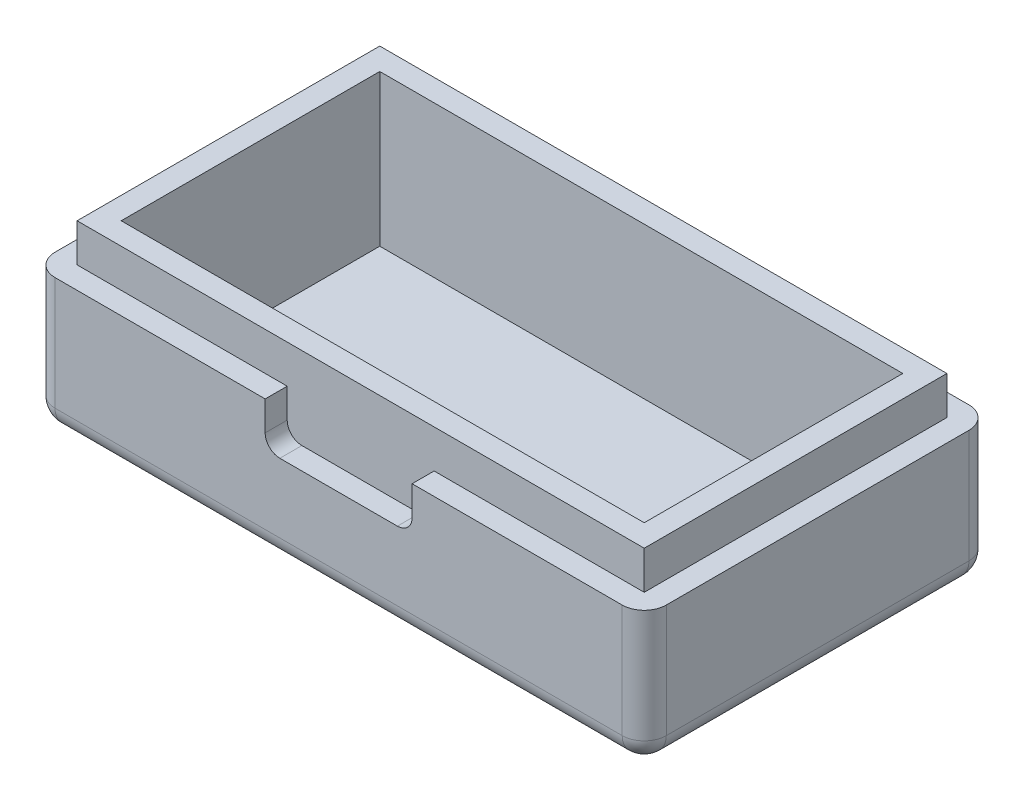
ISO-10303-21;
HEADER;
FILE_DESCRIPTION(('STEP AP214'),'2;1');
FILE_NAME('part.step','',(''),(''),'','','');
FILE_SCHEMA(('AUTOMOTIVE_DESIGN { 1 0 10303 214 1 1 1 1 }'));
ENDSEC;
DATA;
#1=APPLICATION_CONTEXT('core data for automotive mechanical design processes');
#2=APPLICATION_PROTOCOL_DEFINITION('international standard','automotive_design',2000,#1);
#3=PRODUCT_CONTEXT('',#1,'mechanical');
#4=PRODUCT('Part','Part','',(#3));
#5=PRODUCT_RELATED_PRODUCT_CATEGORY('part','',(#4));
#6=PRODUCT_DEFINITION_FORMATION('','',#4);
#7=PRODUCT_DEFINITION_CONTEXT('part definition',#1,'design');
#8=PRODUCT_DEFINITION('design','',#6,#7);
#9=PRODUCT_DEFINITION_SHAPE('','',#8);
#10=(LENGTH_UNIT() NAMED_UNIT(*) SI_UNIT(.MILLI.,.METRE.));
#11=(NAMED_UNIT(*) PLANE_ANGLE_UNIT() SI_UNIT($,.RADIAN.));
#12=(NAMED_UNIT(*) SI_UNIT($,.STERADIAN.) SOLID_ANGLE_UNIT());
#13=UNCERTAINTY_MEASURE_WITH_UNIT(LENGTH_MEASURE(1.E-05),#10,'distance_accuracy_value','');
#14=(GEOMETRIC_REPRESENTATION_CONTEXT(3) GLOBAL_UNCERTAINTY_ASSIGNED_CONTEXT((#13)) GLOBAL_UNIT_ASSIGNED_CONTEXT((#10,
#11,#12)) REPRESENTATION_CONTEXT('',''));
#15=CARTESIAN_POINT('',(0.,0.,0.));
#16=DIRECTION('',(0.,0.,1.));
#17=DIRECTION('',(1.,0.,0.));
#18=AXIS2_PLACEMENT_3D('',#15,#16,#17);
#19=CARTESIAN_POINT('',(0.,9.2,0.));
#20=DIRECTION('',(0.,1.,0.));
#21=DIRECTION('',(0.,0.,1.));
#22=AXIS2_PLACEMENT_3D('',#19,#20,#21);
#23=PLANE('',#22);
#24=DIRECTION('',(0.,0.,1.));
#25=VECTOR('',#24,1.);
#26=CARTESIAN_POINT('',(15.8,9.2,-11.9403065089106));
#27=LINE('',#26,#25);
#28=CARTESIAN_POINT('',(15.8,9.2,-1.5));
#29=VERTEX_POINT('',#28);
#30=CARTESIAN_POINT('',(15.8,9.2,0.));
#31=VERTEX_POINT('',#30);
#32=EDGE_CURVE('E263',#29,#31,#27,.T.);
#33=ORIENTED_EDGE('',*,*,#32,.F.);
#34=DIRECTION('',(1.,0.,0.));
#35=VECTOR('',#34,1.);
#36=CARTESIAN_POINT('',(1.5,9.2,-1.5));
#37=LINE('',#36,#35);
#38=CARTESIAN_POINT('',(1.5,9.2,-1.5));
#39=VERTEX_POINT('',#38);
#40=EDGE_CURVE('E316',#39,#29,#37,.T.);
#41=ORIENTED_EDGE('',*,*,#40,.F.);
#42=DIRECTION('',(0.,0.,1.));
#43=VECTOR('',#42,1.);
#44=CARTESIAN_POINT('',(1.5,9.2,-22.1));
#45=LINE('',#44,#43);
#46=CARTESIAN_POINT('',(1.5,9.2,-22.1));
#47=VERTEX_POINT('',#46);
#48=EDGE_CURVE('E311',#47,#39,#45,.T.);
#49=ORIENTED_EDGE('',*,*,#48,.F.);
#50=DIRECTION('',(-1.,0.,0.));
#51=VECTOR('',#50,1.);
#52=CARTESIAN_POINT('',(1.5,9.2,-22.1));
#53=LINE('',#52,#51);
#54=CARTESIAN_POINT('',(15.8,9.2,-22.1));
#55=VERTEX_POINT('',#54);
#56=EDGE_CURVE('E322',#55,#47,#53,.T.);
#57=ORIENTED_EDGE('',*,*,#56,.F.);
#58=DIRECTION('',(0.,0.,-1.));
#59=VECTOR('',#58,1.);
#60=CARTESIAN_POINT('',(15.8,9.2,-11.6596934910894));
#61=LINE('',#60,#59);
#62=CARTESIAN_POINT('',(15.8,9.2,-23.6));
#63=VERTEX_POINT('',#62);
#64=EDGE_CURVE('E299',#55,#63,#61,.T.);
#65=ORIENTED_EDGE('',*,*,#64,.T.);
#66=DIRECTION('',(-1.,0.,0.));
#67=VECTOR('',#66,1.);
#68=CARTESIAN_POINT('',(0.,9.2,-23.6));
#69=LINE('',#68,#67);
#70=CARTESIAN_POINT('',(1.49999999999999,9.2,-23.6));
#71=VERTEX_POINT('',#70);
#72=EDGE_CURVE('E356',#63,#71,#69,.T.);
#73=ORIENTED_EDGE('',*,*,#72,.T.);
#74=CARTESIAN_POINT('',(1.49999999999999,9.2,-22.1));
#75=DIRECTION('',(0.,1.,0.));
#76=DIRECTION('',(0.,0.,1.));
#77=AXIS2_PLACEMENT_3D('',#74,#75,#76);
#78=CIRCLE('',#77,1.5);
#79=CARTESIAN_POINT('',(0.,9.2,-22.1));
#80=VERTEX_POINT('',#79);
#81=EDGE_CURVE('E430',#71,#80,#78,.T.);
#82=ORIENTED_EDGE('',*,*,#81,.T.);
#83=DIRECTION('',(0.,0.,1.));
#84=VECTOR('',#83,1.);
#85=CARTESIAN_POINT('',(0.,9.2,-23.6));
#86=LINE('',#85,#84);
#87=CARTESIAN_POINT('',(0.,9.2,-1.5));
#88=VERTEX_POINT('',#87);
#89=EDGE_CURVE('E340',#80,#88,#86,.T.);
#90=ORIENTED_EDGE('',*,*,#89,.T.);
#91=CARTESIAN_POINT('',(1.5,9.2,-1.5));
#92=DIRECTION('',(0.,1.,0.));
#93=DIRECTION('',(0.,0.,1.));
#94=AXIS2_PLACEMENT_3D('',#91,#92,#93);
#95=CIRCLE('',#94,1.5);
#96=CARTESIAN_POINT('',(1.5,9.2,0.));
#97=VERTEX_POINT('',#96);
#98=EDGE_CURVE('E43',#88,#97,#95,.T.);
#99=ORIENTED_EDGE('',*,*,#98,.T.);
#100=DIRECTION('',(1.,0.,0.));
#101=VECTOR('',#100,1.);
#102=CARTESIAN_POINT('',(0.,9.2,0.));
#103=LINE('',#102,#101);
#104=EDGE_CURVE('E350',#97,#31,#103,.T.);
#105=ORIENTED_EDGE('',*,*,#104,.T.);
#106=EDGE_LOOP('',(#33,#41,#49,#57,#65,#73,#82,#90,#99,#105));
#107=FACE_BOUND('',#106,.T.);
#108=ADVANCED_FACE('F34',(#107),#23,.T.);
#109=CARTESIAN_POINT('',(0.,11.8,0.));
#110=DIRECTION('',(0.,-1.,0.));
#111=DIRECTION('',(0.,0.,-1.));
#112=AXIS2_PLACEMENT_3D('',#109,#110,#111);
#113=PLANE('',#112);
#114=DIRECTION('',(-1.,0.,0.));
#115=VECTOR('',#114,1.);
#116=CARTESIAN_POINT('',(2.99999999999999,11.8,-20.6));
#117=LINE('',#116,#115);
#118=CARTESIAN_POINT('',(38.6,11.8,-20.6));
#119=VERTEX_POINT('',#118);
#120=CARTESIAN_POINT('',(2.99999999999999,11.8,-20.6));
#121=VERTEX_POINT('',#120);
#122=EDGE_CURVE('E376',#119,#121,#117,.T.);
#123=ORIENTED_EDGE('',*,*,#122,.F.);
#124=DIRECTION('',(0.,0.,-1.));
#125=VECTOR('',#124,1.);
#126=CARTESIAN_POINT('',(38.6,11.8,-3.00000000000001));
#127=LINE('',#126,#125);
#128=CARTESIAN_POINT('',(38.6,11.8,-3.00000000000001));
#129=VERTEX_POINT('',#128);
#130=EDGE_CURVE('E360',#129,#119,#127,.T.);
#131=ORIENTED_EDGE('',*,*,#130,.F.);
#132=DIRECTION('',(1.,0.,0.));
#133=VECTOR('',#132,1.);
#134=CARTESIAN_POINT('',(2.99999999999999,11.8,-3.00000000000001));
#135=LINE('',#134,#133);
#136=CARTESIAN_POINT('',(2.99999999999999,11.8,-3.00000000000001));
#137=VERTEX_POINT('',#136);
#138=EDGE_CURVE('E365',#137,#129,#135,.T.);
#139=ORIENTED_EDGE('',*,*,#138,.F.);
#140=DIRECTION('',(0.,0.,1.));
#141=VECTOR('',#140,1.);
#142=CARTESIAN_POINT('',(2.99999999999999,11.8,-3.00000000000001));
#143=LINE('',#142,#141);
#144=EDGE_CURVE('E379',#121,#137,#143,.T.);
#145=ORIENTED_EDGE('',*,*,#144,.F.);
#146=EDGE_LOOP('',(#123,#131,#139,#145));
#147=FACE_BOUND('',#146,.T.);
#148=DIRECTION('',(0.,0.,1.));
#149=VECTOR('',#148,1.);
#150=CARTESIAN_POINT('',(1.5,11.8,-22.1));
#151=LINE('',#150,#149);
#152=CARTESIAN_POINT('',(1.5,11.8,-22.1));
#153=VERTEX_POINT('',#152);
#154=CARTESIAN_POINT('',(1.5,11.8,-1.5));
#155=VERTEX_POINT('',#154);
#156=EDGE_CURVE('E327',#153,#155,#151,.T.);
#157=ORIENTED_EDGE('',*,*,#156,.T.);
#158=DIRECTION('',(1.,0.,0.));
#159=VECTOR('',#158,1.);
#160=CARTESIAN_POINT('',(1.5,11.8,-1.5));
#161=LINE('',#160,#159);
#162=CARTESIAN_POINT('',(40.1,11.8,-1.5));
#163=VERTEX_POINT('',#162);
#164=EDGE_CURVE('E330',#155,#163,#161,.T.);
#165=ORIENTED_EDGE('',*,*,#164,.T.);
#166=DIRECTION('',(0.,0.,-1.));
#167=VECTOR('',#166,1.);
#168=CARTESIAN_POINT('',(40.1,11.8,-22.1));
#169=LINE('',#168,#167);
#170=CARTESIAN_POINT('',(40.1,11.8,-22.1));
#171=VERTEX_POINT('',#170);
#172=EDGE_CURVE('E333',#163,#171,#169,.T.);
#173=ORIENTED_EDGE('',*,*,#172,.T.);
#174=DIRECTION('',(-1.,0.,0.));
#175=VECTOR('',#174,1.);
#176=CARTESIAN_POINT('',(1.5,11.8,-22.1));
#177=LINE('',#176,#175);
#178=EDGE_CURVE('E315',#171,#153,#177,.T.);
#179=ORIENTED_EDGE('',*,*,#178,.T.);
#180=EDGE_LOOP('',(#157,#165,#173,#179));
#181=FACE_BOUND('',#180,.T.);
#182=ADVANCED_FACE('F521',(#147,#181),#113,.F.);
#183=CARTESIAN_POINT('',(38.6,1.5,-3.00000000000001));
#184=DIRECTION('',(1.,0.,0.));
#185=DIRECTION('',(0.,0.,-1.));
#186=AXIS2_PLACEMENT_3D('',#183,#184,#185);
#187=PLANE('',#186);
#188=ORIENTED_EDGE('',*,*,#130,.T.);
#189=DIRECTION('',(0.,1.,0.));
#190=VECTOR('',#189,1.);
#191=CARTESIAN_POINT('',(38.6,1.5,-20.6));
#192=LINE('',#191,#190);
#193=CARTESIAN_POINT('',(38.6,1.5,-20.6));
#194=VERTEX_POINT('',#193);
#195=EDGE_CURVE('E374',#194,#119,#192,.T.);
#196=ORIENTED_EDGE('',*,*,#195,.F.);
#197=DIRECTION('',(0.,0.,-1.));
#198=VECTOR('',#197,1.);
#199=CARTESIAN_POINT('',(38.6,1.5,-3.00000000000001));
#200=LINE('',#199,#198);
#201=CARTESIAN_POINT('',(38.6,1.5,-3.00000000000001));
#202=VERTEX_POINT('',#201);
#203=EDGE_CURVE('E361',#202,#194,#200,.T.);
#204=ORIENTED_EDGE('',*,*,#203,.F.);
#205=DIRECTION('',(0.,1.,0.));
#206=VECTOR('',#205,1.);
#207=CARTESIAN_POINT('',(38.6,1.5,-3.00000000000001));
#208=LINE('',#207,#206);
#209=EDGE_CURVE('E384',#202,#129,#208,.T.);
#210=ORIENTED_EDGE('',*,*,#209,.T.);
#211=EDGE_LOOP('',(#188,#196,#204,#210));
#212=FACE_BOUND('',#211,.T.);
#213=ADVANCED_FACE('F529',(#212),#187,.F.);
#214=CARTESIAN_POINT('',(2.99999999999999,1.5,-3.00000000000001));
#215=DIRECTION('',(0.,0.,1.));
#216=DIRECTION('',(1.,0.,0.));
#217=AXIS2_PLACEMENT_3D('',#214,#215,#216);
#218=PLANE('',#217);
#219=ORIENTED_EDGE('',*,*,#138,.T.);
#220=ORIENTED_EDGE('',*,*,#209,.F.);
#221=DIRECTION('',(1.,0.,0.));
#222=VECTOR('',#221,1.);
#223=CARTESIAN_POINT('',(2.99999999999999,1.5,-3.00000000000001));
#224=LINE('',#223,#222);
#225=CARTESIAN_POINT('',(2.99999999999999,1.5,-3.00000000000001));
#226=VERTEX_POINT('',#225);
#227=EDGE_CURVE('E371',#226,#202,#224,.T.);
#228=ORIENTED_EDGE('',*,*,#227,.F.);
#229=DIRECTION('',(0.,1.,0.));
#230=VECTOR('',#229,1.);
#231=CARTESIAN_POINT('',(2.99999999999999,1.5,-3.00000000000001));
#232=LINE('',#231,#230);
#233=EDGE_CURVE('E387',#226,#137,#232,.T.);
#234=ORIENTED_EDGE('',*,*,#233,.T.);
#235=EDGE_LOOP('',(#219,#220,#228,#234));
#236=FACE_BOUND('',#235,.T.);
#237=ADVANCED_FACE('F873',(#236),#218,.F.);
#238=CARTESIAN_POINT('',(2.99999999999999,1.5,-3.00000000000001));
#239=DIRECTION('',(-1.,0.,0.));
#240=DIRECTION('',(0.,0.,1.));
#241=AXIS2_PLACEMENT_3D('',#238,#239,#240);
#242=PLANE('',#241);
#243=ORIENTED_EDGE('',*,*,#144,.T.);
#244=ORIENTED_EDGE('',*,*,#233,.F.);
#245=DIRECTION('',(0.,0.,1.));
#246=VECTOR('',#245,1.);
#247=CARTESIAN_POINT('',(2.99999999999999,1.5,-3.00000000000001));
#248=LINE('',#247,#246);
#249=CARTESIAN_POINT('',(2.99999999999999,1.5,-20.6));
#250=VERTEX_POINT('',#249);
#251=EDGE_CURVE('E368',#250,#226,#248,.T.);
#252=ORIENTED_EDGE('',*,*,#251,.F.);
#253=DIRECTION('',(0.,1.,0.));
#254=VECTOR('',#253,1.);
#255=CARTESIAN_POINT('',(2.99999999999999,1.5,-20.6));
#256=LINE('',#255,#254);
#257=EDGE_CURVE('E389',#250,#121,#256,.T.);
#258=ORIENTED_EDGE('',*,*,#257,.T.);
#259=EDGE_LOOP('',(#243,#244,#252,#258));
#260=FACE_BOUND('',#259,.T.);
#261=ADVANCED_FACE('F864',(#260),#242,.F.);
#262=CARTESIAN_POINT('',(2.99999999999999,1.5,-20.6));
#263=DIRECTION('',(0.,0.,-1.));
#264=DIRECTION('',(-1.,0.,0.));
#265=AXIS2_PLACEMENT_3D('',#262,#263,#264);
#266=PLANE('',#265);
#267=ORIENTED_EDGE('',*,*,#122,.T.);
#268=ORIENTED_EDGE('',*,*,#257,.F.);
#269=DIRECTION('',(-1.,0.,0.));
#270=VECTOR('',#269,1.);
#271=CARTESIAN_POINT('',(2.99999999999999,1.5,-20.6));
#272=LINE('',#271,#270);
#273=EDGE_CURVE('E364',#194,#250,#272,.T.);
#274=ORIENTED_EDGE('',*,*,#273,.F.);
#275=ORIENTED_EDGE('',*,*,#195,.T.);
#276=EDGE_LOOP('',(#267,#268,#274,#275));
#277=FACE_BOUND('',#276,.T.);
#278=ADVANCED_FACE('F543',(#277),#266,.F.);
#279=CARTESIAN_POINT('',(0.,1.5,0.));
#280=DIRECTION('',(0.,-1.,0.));
#281=DIRECTION('',(0.,0.,-1.));
#282=AXIS2_PLACEMENT_3D('',#279,#280,#281);
#283=PLANE('',#282);
#284=ORIENTED_EDGE('',*,*,#203,.T.);
#285=ORIENTED_EDGE('',*,*,#273,.T.);
#286=ORIENTED_EDGE('',*,*,#251,.T.);
#287=ORIENTED_EDGE('',*,*,#227,.T.);
#288=EDGE_LOOP('',(#284,#285,#286,#287));
#289=FACE_BOUND('',#288,.T.);
#290=ADVANCED_FACE('F535',(#289),#283,.F.);
#291=DIRECTION('',(0.,0.,1.));
#292=VECTOR('',#291,1.);
#293=CARTESIAN_POINT('',(25.8,9.2,-11.9403065089106));
#294=LINE('',#293,#292);
#295=CARTESIAN_POINT('',(25.8,9.2,-1.5));
#296=VERTEX_POINT('',#295);
#297=CARTESIAN_POINT('',(25.8,9.2,0.));
#298=VERTEX_POINT('',#297);
#299=EDGE_CURVE('E265',#296,#298,#294,.T.);
#300=ORIENTED_EDGE('',*,*,#299,.T.);
#301=CARTESIAN_POINT('',(40.1,9.2,0.));
#302=VERTEX_POINT('',#301);
#303=EDGE_CURVE('E349',#298,#302,#103,.T.);
#304=ORIENTED_EDGE('',*,*,#303,.T.);
#305=CARTESIAN_POINT('',(40.1,9.2,-1.5));
#306=DIRECTION('',(0.,1.,0.));
#307=DIRECTION('',(0.,0.,1.));
#308=AXIS2_PLACEMENT_3D('',#305,#306,#307);
#309=CIRCLE('',#308,1.5);
#310=CARTESIAN_POINT('',(41.6,9.2,-1.5));
#311=VERTEX_POINT('',#310);
#312=EDGE_CURVE('E11',#302,#311,#309,.T.);
#313=ORIENTED_EDGE('',*,*,#312,.T.);
#314=DIRECTION('',(0.,0.,-1.));
#315=VECTOR('',#314,1.);
#316=CARTESIAN_POINT('',(41.6,9.2,-23.6));
#317=LINE('',#316,#315);
#318=CARTESIAN_POINT('',(41.6,9.2,-22.1));
#319=VERTEX_POINT('',#318);
#320=EDGE_CURVE('E353',#311,#319,#317,.T.);
#321=ORIENTED_EDGE('',*,*,#320,.T.);
#322=CARTESIAN_POINT('',(40.1,9.2,-22.1));
#323=DIRECTION('',(0.,1.,0.));
#324=DIRECTION('',(0.,0.,1.));
#325=AXIS2_PLACEMENT_3D('',#322,#323,#324);
#326=CIRCLE('',#325,1.5);
#327=CARTESIAN_POINT('',(40.1,9.2,-23.6));
#328=VERTEX_POINT('',#327);
#329=EDGE_CURVE('E428',#319,#328,#326,.T.);
#330=ORIENTED_EDGE('',*,*,#329,.T.);
#331=CARTESIAN_POINT('',(25.8,9.2,-23.6));
#332=VERTEX_POINT('',#331);
#333=EDGE_CURVE('E357',#328,#332,#69,.T.);
#334=ORIENTED_EDGE('',*,*,#333,.T.);
#335=DIRECTION('',(0.,0.,-1.));
#336=VECTOR('',#335,1.);
#337=CARTESIAN_POINT('',(25.8,9.2,-11.6596934910894));
#338=LINE('',#337,#336);
#339=CARTESIAN_POINT('',(25.8,9.2,-22.1));
#340=VERTEX_POINT('',#339);
#341=EDGE_CURVE('E278',#340,#332,#338,.T.);
#342=ORIENTED_EDGE('',*,*,#341,.F.);
#343=CARTESIAN_POINT('',(40.1,9.2,-22.1));
#344=VERTEX_POINT('',#343);
#345=EDGE_CURVE('E323',#344,#340,#53,.T.);
#346=ORIENTED_EDGE('',*,*,#345,.F.);
#347=DIRECTION('',(0.,0.,-1.));
#348=VECTOR('',#347,1.);
#349=CARTESIAN_POINT('',(40.1,9.2,-22.1));
#350=LINE('',#349,#348);
#351=CARTESIAN_POINT('',(40.1,9.2,-1.5));
#352=VERTEX_POINT('',#351);
#353=EDGE_CURVE('E319',#352,#344,#350,.T.);
#354=ORIENTED_EDGE('',*,*,#353,.F.);
#355=EDGE_CURVE('E314',#296,#352,#37,.T.);
#356=ORIENTED_EDGE('',*,*,#355,.F.);
#357=EDGE_LOOP('',(#300,#304,#313,#321,#330,#334,#342,#346,#354,#356));
#358=FACE_BOUND('',#357,.T.);
#359=ADVANCED_FACE('F523',(#358),#23,.T.);
#360=CARTESIAN_POINT('',(1.5,9.2,-22.1));
#361=DIRECTION('',(-1.,0.,0.));
#362=DIRECTION('',(0.,0.,1.));
#363=AXIS2_PLACEMENT_3D('',#360,#361,#362);
#364=PLANE('',#363);
#365=ORIENTED_EDGE('',*,*,#156,.F.);
#366=DIRECTION('',(0.,1.,0.));
#367=VECTOR('',#366,1.);
#368=CARTESIAN_POINT('',(1.5,9.2,-22.1));
#369=LINE('',#368,#367);
#370=EDGE_CURVE('E338',#47,#153,#369,.T.);
#371=ORIENTED_EDGE('',*,*,#370,.F.);
#372=ORIENTED_EDGE('',*,*,#48,.T.);
#373=DIRECTION('',(0.,1.,0.));
#374=VECTOR('',#373,1.);
#375=CARTESIAN_POINT('',(1.5,9.2,-1.5));
#376=LINE('',#375,#374);
#377=EDGE_CURVE('E326',#39,#155,#376,.T.);
#378=ORIENTED_EDGE('',*,*,#377,.T.);
#379=EDGE_LOOP('',(#365,#371,#372,#378));
#380=FACE_BOUND('',#379,.T.);
#381=ADVANCED_FACE('F534',(#380),#364,.T.);
#382=CARTESIAN_POINT('',(1.5,9.2,-22.1));
#383=DIRECTION('',(0.,0.,-1.));
#384=DIRECTION('',(-1.,0.,0.));
#385=AXIS2_PLACEMENT_3D('',#382,#383,#384);
#386=PLANE('',#385);
#387=ORIENTED_EDGE('',*,*,#178,.F.);
#388=DIRECTION('',(0.,1.,0.));
#389=VECTOR('',#388,1.);
#390=CARTESIAN_POINT('',(40.1,9.2,-22.1));
#391=LINE('',#390,#389);
#392=EDGE_CURVE('E341',#344,#171,#391,.T.);
#393=ORIENTED_EDGE('',*,*,#392,.F.);
#394=ORIENTED_EDGE('',*,*,#345,.T.);
#395=DIRECTION('',(0.,1.,0.));
#396=VECTOR('',#395,1.);
#397=CARTESIAN_POINT('',(25.8,9.2,-22.1));
#398=LINE('',#397,#396);
#399=CARTESIAN_POINT('',(25.8,7.20000000000001,-22.1));
#400=VERTEX_POINT('',#399);
#401=EDGE_CURVE('E282',#400,#340,#398,.T.);
#402=ORIENTED_EDGE('',*,*,#401,.F.);
#403=CARTESIAN_POINT('',(24.8,7.2,-22.1));
#404=DIRECTION('',(0.,0.,-1.));
#405=DIRECTION('',(-1.,0.,0.));
#406=AXIS2_PLACEMENT_3D('',#403,#404,#405);
#407=CIRCLE('',#406,1.);
#408=CARTESIAN_POINT('',(24.8,6.2,-22.1));
#409=VERTEX_POINT('',#408);
#410=EDGE_CURVE('E284',#409,#400,#407,.F.);
#411=ORIENTED_EDGE('',*,*,#410,.F.);
#412=DIRECTION('',(1.,0.,0.));
#413=VECTOR('',#412,1.);
#414=CARTESIAN_POINT('',(24.8,6.2,-22.1));
#415=LINE('',#414,#413);
#416=CARTESIAN_POINT('',(16.8,6.2,-22.1));
#417=VERTEX_POINT('',#416);
#418=EDGE_CURVE('E275',#417,#409,#415,.T.);
#419=ORIENTED_EDGE('',*,*,#418,.F.);
#420=CARTESIAN_POINT('',(16.8,7.2,-22.1));
#421=DIRECTION('',(0.,0.,-1.));
#422=DIRECTION('',(-1.,0.,0.));
#423=AXIS2_PLACEMENT_3D('',#420,#421,#422);
#424=CIRCLE('',#423,1.);
#425=CARTESIAN_POINT('',(15.8,7.2,-22.1));
#426=VERTEX_POINT('',#425);
#427=EDGE_CURVE('E277',#426,#417,#424,.F.);
#428=ORIENTED_EDGE('',*,*,#427,.F.);
#429=DIRECTION('',(0.,-1.,0.));
#430=VECTOR('',#429,1.);
#431=CARTESIAN_POINT('',(15.8,9.2,-22.1));
#432=LINE('',#431,#430);
#433=EDGE_CURVE('E280',#55,#426,#432,.T.);
#434=ORIENTED_EDGE('',*,*,#433,.F.);
#435=ORIENTED_EDGE('',*,*,#56,.T.);
#436=ORIENTED_EDGE('',*,*,#370,.T.);
#437=EDGE_LOOP('',(#387,#393,#394,#402,#411,#419,#428,#434,#435,#436));
#438=FACE_BOUND('',#437,.T.);
#439=ADVANCED_FACE('F540',(#438),#386,.T.);
#440=CARTESIAN_POINT('',(40.1,9.2,-22.1));
#441=DIRECTION('',(1.,0.,0.));
#442=DIRECTION('',(0.,0.,-1.));
#443=AXIS2_PLACEMENT_3D('',#440,#441,#442);
#444=PLANE('',#443);
#445=ORIENTED_EDGE('',*,*,#172,.F.);
#446=DIRECTION('',(0.,1.,0.));
#447=VECTOR('',#446,1.);
#448=CARTESIAN_POINT('',(40.1,9.2,-1.5));
#449=LINE('',#448,#447);
#450=EDGE_CURVE('E343',#352,#163,#449,.T.);
#451=ORIENTED_EDGE('',*,*,#450,.F.);
#452=ORIENTED_EDGE('',*,*,#353,.T.);
#453=ORIENTED_EDGE('',*,*,#392,.T.);
#454=EDGE_LOOP('',(#445,#451,#452,#453));
#455=FACE_BOUND('',#454,.T.);
#456=ADVANCED_FACE('F609',(#455),#444,.T.);
#457=CARTESIAN_POINT('',(1.5,9.2,-1.5));
#458=DIRECTION('',(0.,0.,1.));
#459=DIRECTION('',(1.,0.,0.));
#460=AXIS2_PLACEMENT_3D('',#457,#458,#459);
#461=PLANE('',#460);
#462=ORIENTED_EDGE('',*,*,#164,.F.);
#463=ORIENTED_EDGE('',*,*,#377,.F.);
#464=ORIENTED_EDGE('',*,*,#40,.T.);
#465=DIRECTION('',(0.,1.,0.));
#466=VECTOR('',#465,1.);
#467=CARTESIAN_POINT('',(15.8,9.2,-1.5));
#468=LINE('',#467,#466);
#469=CARTESIAN_POINT('',(15.8,7.20000000000001,-1.5));
#470=VERTEX_POINT('',#469);
#471=EDGE_CURVE('E274',#470,#29,#468,.T.);
#472=ORIENTED_EDGE('',*,*,#471,.F.);
#473=CARTESIAN_POINT('',(16.8,7.2,-1.5));
#474=DIRECTION('',(0.,0.,1.));
#475=DIRECTION('',(1.,0.,0.));
#476=AXIS2_PLACEMENT_3D('',#473,#474,#475);
#477=CIRCLE('',#476,1.);
#478=CARTESIAN_POINT('',(16.8,6.2,-1.5));
#479=VERTEX_POINT('',#478);
#480=EDGE_CURVE('E272',#479,#470,#477,.F.);
#481=ORIENTED_EDGE('',*,*,#480,.F.);
#482=DIRECTION('',(-1.,0.,0.));
#483=VECTOR('',#482,1.);
#484=CARTESIAN_POINT('',(16.8,6.2,-1.5));
#485=LINE('',#484,#483);
#486=CARTESIAN_POINT('',(24.8,6.2,-1.5));
#487=VERTEX_POINT('',#486);
#488=EDGE_CURVE('E242',#487,#479,#485,.T.);
#489=ORIENTED_EDGE('',*,*,#488,.F.);
#490=CARTESIAN_POINT('',(24.8,7.2,-1.5));
#491=DIRECTION('',(0.,0.,1.));
#492=DIRECTION('',(1.,0.,0.));
#493=AXIS2_PLACEMENT_3D('',#490,#491,#492);
#494=CIRCLE('',#493,1.);
#495=CARTESIAN_POINT('',(25.8,7.2,-1.5));
#496=VERTEX_POINT('',#495);
#497=EDGE_CURVE('E493',#496,#487,#494,.F.);
#498=ORIENTED_EDGE('',*,*,#497,.F.);
#499=DIRECTION('',(0.,-1.,0.));
#500=VECTOR('',#499,1.);
#501=CARTESIAN_POINT('',(25.8,9.2,-1.5));
#502=LINE('',#501,#500);
#503=EDGE_CURVE('E491',#296,#496,#502,.T.);
#504=ORIENTED_EDGE('',*,*,#503,.F.);
#505=ORIENTED_EDGE('',*,*,#355,.T.);
#506=ORIENTED_EDGE('',*,*,#450,.T.);
#507=EDGE_LOOP('',(#462,#463,#464,#472,#481,#489,#498,#504,#505,#506));
#508=FACE_BOUND('',#507,.T.);
#509=ADVANCED_FACE('F501',(#508),#461,.T.);
#510=CARTESIAN_POINT('',(0.,0.,0.));
#511=DIRECTION('',(0.,-1.,0.));
#512=DIRECTION('',(0.,0.,-1.));
#513=AXIS2_PLACEMENT_3D('',#510,#511,#512);
#514=PLANE('',#513);
#515=DIRECTION('',(0.,0.,-1.));
#516=VECTOR('',#515,1.);
#517=CARTESIAN_POINT('',(40.1,0.,0.));
#518=LINE('',#517,#516);
#519=CARTESIAN_POINT('',(40.1,0.,-22.1));
#520=VERTEX_POINT('',#519);
#521=CARTESIAN_POINT('',(40.1,0.,-1.5));
#522=VERTEX_POINT('',#521);
#523=EDGE_CURVE('E404',#520,#522,#518,.F.);
#524=ORIENTED_EDGE('',*,*,#523,.T.);
#525=DIRECTION('',(1.,0.,0.));
#526=VECTOR('',#525,1.);
#527=CARTESIAN_POINT('',(0.,0.,-1.5));
#528=LINE('',#527,#526);
#529=CARTESIAN_POINT('',(1.5,0.,-1.5));
#530=VERTEX_POINT('',#529);
#531=EDGE_CURVE('E406',#522,#530,#528,.F.);
#532=ORIENTED_EDGE('',*,*,#531,.T.);
#533=DIRECTION('',(0.,0.,1.));
#534=VECTOR('',#533,1.);
#535=CARTESIAN_POINT('',(1.49999999999999,0.,-23.6));
#536=LINE('',#535,#534);
#537=CARTESIAN_POINT('',(1.49999999999999,0.,-22.1));
#538=VERTEX_POINT('',#537);
#539=EDGE_CURVE('E400',#530,#538,#536,.F.);
#540=ORIENTED_EDGE('',*,*,#539,.T.);
#541=DIRECTION('',(-1.,0.,0.));
#542=VECTOR('',#541,1.);
#543=CARTESIAN_POINT('',(41.6,0.,-22.1));
#544=LINE('',#543,#542);
#545=EDGE_CURVE('E402',#538,#520,#544,.F.);
#546=ORIENTED_EDGE('',*,*,#545,.T.);
#547=EDGE_LOOP('',(#524,#532,#540,#546));
#548=FACE_BOUND('',#547,.T.);
#549=ADVANCED_FACE('F576',(#548),#514,.T.);
#550=CARTESIAN_POINT('',(0.,11.8,-23.6));
#551=DIRECTION('',(0.,0.,1.));
#552=DIRECTION('',(1.,0.,0.));
#553=AXIS2_PLACEMENT_3D('',#550,#551,#552);
#554=PLANE('',#553);
#555=CARTESIAN_POINT('',(24.8,7.2,-23.6));
#556=DIRECTION('',(0.,0.,-1.));
#557=DIRECTION('',(-1.,0.,0.));
#558=AXIS2_PLACEMENT_3D('',#555,#556,#557);
#559=CIRCLE('',#558,1.);
#560=CARTESIAN_POINT('',(25.8,7.2,-23.6));
#561=VERTEX_POINT('',#560);
#562=CARTESIAN_POINT('',(24.8,6.2,-23.6));
#563=VERTEX_POINT('',#562);
#564=EDGE_CURVE('E286',#561,#563,#559,.T.);
#565=ORIENTED_EDGE('',*,*,#564,.F.);
#566=DIRECTION('',(0.,-1.,0.));
#567=VECTOR('',#566,1.);
#568=CARTESIAN_POINT('',(25.8,9.2,-23.6));
#569=LINE('',#568,#567);
#570=EDGE_CURVE('E59',#332,#561,#569,.T.);
#571=ORIENTED_EDGE('',*,*,#570,.F.);
#572=ORIENTED_EDGE('',*,*,#333,.F.);
#573=DIRECTION('',(0.,-1.,0.));
#574=VECTOR('',#573,1.);
#575=CARTESIAN_POINT('',(40.1,11.8,-23.6));
#576=LINE('',#575,#574);
#577=CARTESIAN_POINT('',(40.1,1.5,-23.6));
#578=VERTEX_POINT('',#577);
#579=EDGE_CURVE('E415',#328,#578,#576,.T.);
#580=ORIENTED_EDGE('',*,*,#579,.T.);
#581=DIRECTION('',(-1.,0.,0.));
#582=VECTOR('',#581,1.);
#583=CARTESIAN_POINT('',(0.,1.5,-23.6));
#584=LINE('',#583,#582);
#585=CARTESIAN_POINT('',(1.49999999999999,1.5,-23.6));
#586=VERTEX_POINT('',#585);
#587=EDGE_CURVE('E417',#578,#586,#584,.T.);
#588=ORIENTED_EDGE('',*,*,#587,.T.);
#589=DIRECTION('',(0.,-1.,0.));
#590=VECTOR('',#589,1.);
#591=CARTESIAN_POINT('',(1.49999999999999,11.8,-23.6));
#592=LINE('',#591,#590);
#593=EDGE_CURVE('E419',#586,#71,#592,.F.);
#594=ORIENTED_EDGE('',*,*,#593,.T.);
#595=ORIENTED_EDGE('',*,*,#72,.F.);
#596=DIRECTION('',(0.,1.,0.));
#597=VECTOR('',#596,1.);
#598=CARTESIAN_POINT('',(15.8,9.2,-23.6));
#599=LINE('',#598,#597);
#600=CARTESIAN_POINT('',(15.8,7.20000000000001,-23.6));
#601=VERTEX_POINT('',#600);
#602=EDGE_CURVE('E295',#601,#63,#599,.T.);
#603=ORIENTED_EDGE('',*,*,#602,.F.);
#604=CARTESIAN_POINT('',(16.8,7.2,-23.6));
#605=DIRECTION('',(0.,0.,-1.));
#606=DIRECTION('',(-1.,0.,0.));
#607=AXIS2_PLACEMENT_3D('',#604,#605,#606);
#608=CIRCLE('',#607,1.);
#609=CARTESIAN_POINT('',(16.8,6.2,-23.6));
#610=VERTEX_POINT('',#609);
#611=EDGE_CURVE('E292',#610,#601,#608,.T.);
#612=ORIENTED_EDGE('',*,*,#611,.F.);
#613=DIRECTION('',(-1.,0.,0.));
#614=VECTOR('',#613,1.);
#615=CARTESIAN_POINT('',(24.8,6.2,-23.6));
#616=LINE('',#615,#614);
#617=EDGE_CURVE('E289',#563,#610,#616,.T.);
#618=ORIENTED_EDGE('',*,*,#617,.F.);
#619=EDGE_LOOP('',(#565,#571,#572,#580,#588,#594,#595,#603,#612,#618));
#620=FACE_BOUND('',#619,.T.);
#621=ADVANCED_FACE('F581',(#620),#554,.F.);
#622=CARTESIAN_POINT('',(41.6,11.8,0.));
#623=DIRECTION('',(-1.,0.,0.));
#624=DIRECTION('',(0.,0.,1.));
#625=AXIS2_PLACEMENT_3D('',#622,#623,#624);
#626=PLANE('',#625);
#627=ORIENTED_EDGE('',*,*,#320,.F.);
#628=DIRECTION('',(0.,-1.,0.));
#629=VECTOR('',#628,1.);
#630=CARTESIAN_POINT('',(41.6,11.8,-1.5));
#631=LINE('',#630,#629);
#632=CARTESIAN_POINT('',(41.6,1.5,-1.5));
#633=VERTEX_POINT('',#632);
#634=EDGE_CURVE('E413',#311,#633,#631,.T.);
#635=ORIENTED_EDGE('',*,*,#634,.T.);
#636=DIRECTION('',(0.,0.,-1.));
#637=VECTOR('',#636,1.);
#638=CARTESIAN_POINT('',(41.6,1.5,-23.6));
#639=LINE('',#638,#637);
#640=CARTESIAN_POINT('',(41.6,1.5,-22.1));
#641=VERTEX_POINT('',#640);
#642=EDGE_CURVE('E411',#633,#641,#639,.T.);
#643=ORIENTED_EDGE('',*,*,#642,.T.);
#644=DIRECTION('',(0.,-1.,0.));
#645=VECTOR('',#644,1.);
#646=CARTESIAN_POINT('',(41.6,11.8,-22.1));
#647=LINE('',#646,#645);
#648=EDGE_CURVE('E409',#641,#319,#647,.F.);
#649=ORIENTED_EDGE('',*,*,#648,.T.);
#650=EDGE_LOOP('',(#627,#635,#643,#649));
#651=FACE_BOUND('',#650,.T.);
#652=ADVANCED_FACE('F559',(#651),#626,.F.);
#653=CARTESIAN_POINT('',(0.,11.8,0.));
#654=DIRECTION('',(0.,0.,-1.));
#655=DIRECTION('',(-1.,0.,0.));
#656=AXIS2_PLACEMENT_3D('',#653,#654,#655);
#657=PLANE('',#656);
#658=CARTESIAN_POINT('',(16.8,7.2,0.));
#659=DIRECTION('',(0.,0.,1.));
#660=DIRECTION('',(1.,0.,0.));
#661=AXIS2_PLACEMENT_3D('',#658,#659,#660);
#662=CIRCLE('',#661,1.);
#663=CARTESIAN_POINT('',(15.8,7.2,0.));
#664=VERTEX_POINT('',#663);
#665=CARTESIAN_POINT('',(16.8,6.2,0.));
#666=VERTEX_POINT('',#665);
#667=EDGE_CURVE('E249',#664,#666,#662,.T.);
#668=ORIENTED_EDGE('',*,*,#667,.F.);
#669=DIRECTION('',(0.,-1.,0.));
#670=VECTOR('',#669,1.);
#671=CARTESIAN_POINT('',(15.8,9.2,0.));
#672=LINE('',#671,#670);
#673=EDGE_CURVE('E51',#31,#664,#672,.T.);
#674=ORIENTED_EDGE('',*,*,#673,.F.);
#675=ORIENTED_EDGE('',*,*,#104,.F.);
#676=DIRECTION('',(0.,-1.,0.));
#677=VECTOR('',#676,1.);
#678=CARTESIAN_POINT('',(1.5,11.8,0.));
#679=LINE('',#678,#677);
#680=CARTESIAN_POINT('',(1.5,1.5,0.));
#681=VERTEX_POINT('',#680);
#682=EDGE_CURVE('E386',#97,#681,#679,.T.);
#683=ORIENTED_EDGE('',*,*,#682,.T.);
#684=DIRECTION('',(1.,0.,0.));
#685=VECTOR('',#684,1.);
#686=CARTESIAN_POINT('',(41.6,1.5,0.));
#687=LINE('',#686,#685);
#688=CARTESIAN_POINT('',(40.1,1.5,0.));
#689=VERTEX_POINT('',#688);
#690=EDGE_CURVE('E394',#681,#689,#687,.T.);
#691=ORIENTED_EDGE('',*,*,#690,.T.);
#692=DIRECTION('',(0.,-1.,0.));
#693=VECTOR('',#692,1.);
#694=CARTESIAN_POINT('',(40.1,11.8,0.));
#695=LINE('',#694,#693);
#696=EDGE_CURVE('E397',#689,#302,#695,.F.);
#697=ORIENTED_EDGE('',*,*,#696,.T.);
#698=ORIENTED_EDGE('',*,*,#303,.F.);
#699=DIRECTION('',(0.,1.,0.));
#700=VECTOR('',#699,1.);
#701=CARTESIAN_POINT('',(25.8,9.2,0.));
#702=LINE('',#701,#700);
#703=CARTESIAN_POINT('',(25.8,7.20000000000001,0.));
#704=VERTEX_POINT('',#703);
#705=EDGE_CURVE('E258',#704,#298,#702,.T.);
#706=ORIENTED_EDGE('',*,*,#705,.F.);
#707=CARTESIAN_POINT('',(24.8,7.2,0.));
#708=DIRECTION('',(0.,0.,1.));
#709=DIRECTION('',(1.,0.,0.));
#710=AXIS2_PLACEMENT_3D('',#707,#708,#709);
#711=CIRCLE('',#710,1.);
#712=CARTESIAN_POINT('',(24.8,6.2,0.));
#713=VERTEX_POINT('',#712);
#714=EDGE_CURVE('E256',#713,#704,#711,.T.);
#715=ORIENTED_EDGE('',*,*,#714,.F.);
#716=DIRECTION('',(1.,0.,0.));
#717=VECTOR('',#716,1.);
#718=CARTESIAN_POINT('',(16.8,6.2,0.));
#719=LINE('',#718,#717);
#720=EDGE_CURVE('E239',#666,#713,#719,.T.);
#721=ORIENTED_EDGE('',*,*,#720,.F.);
#722=EDGE_LOOP('',(#668,#674,#675,#683,#691,#697,#698,#706,#715,#721));
#723=FACE_BOUND('',#722,.T.);
#724=ADVANCED_FACE('F253',(#723),#657,.F.);
#725=CARTESIAN_POINT('',(0.,11.8,0.));
#726=DIRECTION('',(1.,0.,0.));
#727=DIRECTION('',(0.,0.,-1.));
#728=AXIS2_PLACEMENT_3D('',#725,#726,#727);
#729=PLANE('',#728);
#730=DIRECTION('',(0.,0.,1.));
#731=VECTOR('',#730,1.);
#732=CARTESIAN_POINT('',(0.,1.5,0.));
#733=LINE('',#732,#731);
#734=CARTESIAN_POINT('',(0.,1.5,-22.1));
#735=VERTEX_POINT('',#734);
#736=CARTESIAN_POINT('',(0.,1.5,-1.5));
#737=VERTEX_POINT('',#736);
#738=EDGE_CURVE('E424',#735,#737,#733,.T.);
#739=ORIENTED_EDGE('',*,*,#738,.T.);
#740=DIRECTION('',(0.,-1.,0.));
#741=VECTOR('',#740,1.);
#742=CARTESIAN_POINT('',(0.,11.8,-1.5));
#743=LINE('',#742,#741);
#744=EDGE_CURVE('E426',#737,#88,#743,.F.);
#745=ORIENTED_EDGE('',*,*,#744,.T.);
#746=ORIENTED_EDGE('',*,*,#89,.F.);
#747=DIRECTION('',(0.,-1.,0.));
#748=VECTOR('',#747,1.);
#749=CARTESIAN_POINT('',(0.,11.8,-22.1));
#750=LINE('',#749,#748);
#751=EDGE_CURVE('E422',#80,#735,#750,.T.);
#752=ORIENTED_EDGE('',*,*,#751,.T.);
#753=EDGE_LOOP('',(#739,#745,#746,#752));
#754=FACE_BOUND('',#753,.T.);
#755=ADVANCED_FACE('F477',(#754),#729,.F.);
#756=CARTESIAN_POINT('',(1.49999999999999,11.8,-22.1));
#757=DIRECTION('',(0.,-1.,0.));
#758=DIRECTION('',(0.,0.,-1.));
#759=AXIS2_PLACEMENT_3D('',#756,#757,#758);
#760=CYLINDRICAL_SURFACE('',#759,1.5);
#761=ORIENTED_EDGE('',*,*,#81,.F.);
#762=ORIENTED_EDGE('',*,*,#593,.F.);
#763=CARTESIAN_POINT('',(1.49999999999999,1.5,-22.1));
#764=DIRECTION('',(0.,-1.,0.));
#765=DIRECTION('',(0.,0.,-1.));
#766=AXIS2_PLACEMENT_3D('',#763,#764,#765);
#767=CIRCLE('',#766,1.5);
#768=EDGE_CURVE('E459',#735,#586,#767,.T.);
#769=ORIENTED_EDGE('',*,*,#768,.F.);
#770=ORIENTED_EDGE('',*,*,#751,.F.);
#771=EDGE_LOOP('',(#761,#762,#769,#770));
#772=FACE_BOUND('',#771,.T.);
#773=ADVANCED_FACE('F36',(#772),#760,.T.);
#774=CARTESIAN_POINT('',(40.1,11.8,-22.1));
#775=DIRECTION('',(0.,-1.,0.));
#776=DIRECTION('',(0.,0.,-1.));
#777=AXIS2_PLACEMENT_3D('',#774,#775,#776);
#778=CYLINDRICAL_SURFACE('',#777,1.5);
#779=ORIENTED_EDGE('',*,*,#329,.F.);
#780=ORIENTED_EDGE('',*,*,#648,.F.);
#781=CARTESIAN_POINT('',(40.1,1.5,-22.1));
#782=DIRECTION('',(0.,-1.,0.));
#783=DIRECTION('',(0.,0.,-1.));
#784=AXIS2_PLACEMENT_3D('',#781,#782,#783);
#785=CIRCLE('',#784,1.5);
#786=EDGE_CURVE('E457',#578,#641,#785,.T.);
#787=ORIENTED_EDGE('',*,*,#786,.F.);
#788=ORIENTED_EDGE('',*,*,#579,.F.);
#789=EDGE_LOOP('',(#779,#780,#787,#788));
#790=FACE_BOUND('',#789,.T.);
#791=ADVANCED_FACE('F564',(#790),#778,.T.);
#792=CARTESIAN_POINT('',(0.,1.5,-22.1));
#793=DIRECTION('',(1.,0.,0.));
#794=DIRECTION('',(0.,0.,-1.));
#795=AXIS2_PLACEMENT_3D('',#792,#793,#794);
#796=CYLINDRICAL_SURFACE('',#795,1.5);
#797=CARTESIAN_POINT('',(1.49999999999999,1.5,-22.1));
#798=DIRECTION('',(-1.,0.,0.));
#799=DIRECTION('',(0.,0.,1.));
#800=AXIS2_PLACEMENT_3D('',#797,#798,#799);
#801=CIRCLE('',#800,1.5);
#802=EDGE_CURVE('E38',#586,#538,#801,.T.);
#803=ORIENTED_EDGE('',*,*,#802,.F.);
#804=ORIENTED_EDGE('',*,*,#587,.F.);
#805=CARTESIAN_POINT('',(40.1,1.5,-22.1));
#806=DIRECTION('',(1.,0.,0.));
#807=DIRECTION('',(0.,0.,-1.));
#808=AXIS2_PLACEMENT_3D('',#805,#806,#807);
#809=CIRCLE('',#808,1.5);
#810=EDGE_CURVE('E454',#520,#578,#809,.T.);
#811=ORIENTED_EDGE('',*,*,#810,.F.);
#812=ORIENTED_EDGE('',*,*,#545,.F.);
#813=EDGE_LOOP('',(#803,#804,#811,#812));
#814=FACE_BOUND('',#813,.T.);
#815=ADVANCED_FACE('F577',(#814),#796,.T.);
#816=CARTESIAN_POINT('',(1.49999999999999,1.5,-22.1));
#817=DIRECTION('',(0.,0.,1.));
#818=DIRECTION('',(1.,0.,0.));
#819=AXIS2_PLACEMENT_3D('',#816,#817,#818);
#820=SPHERICAL_SURFACE('',#819,1.5);
#821=ORIENTED_EDGE('',*,*,#768,.T.);
#822=ORIENTED_EDGE('',*,*,#802,.T.);
#823=CARTESIAN_POINT('',(1.49999999999999,1.5,-22.1));
#824=DIRECTION('',(0.,0.,-1.));
#825=DIRECTION('',(-1.,0.,0.));
#826=AXIS2_PLACEMENT_3D('',#823,#824,#825);
#827=CIRCLE('',#826,1.5);
#828=EDGE_CURVE('E451',#735,#538,#827,.F.);
#829=ORIENTED_EDGE('',*,*,#828,.F.);
#830=EDGE_LOOP('',(#821,#822,#829));
#831=FACE_BOUND('',#830,.T.);
#832=ADVANCED_FACE('F466',(#831),#820,.T.);
#833=CARTESIAN_POINT('',(40.1,1.5,-22.1));
#834=DIRECTION('',(0.,0.,1.));
#835=DIRECTION('',(1.,0.,0.));
#836=AXIS2_PLACEMENT_3D('',#833,#834,#835);
#837=SPHERICAL_SURFACE('',#836,1.5);
#838=ORIENTED_EDGE('',*,*,#810,.T.);
#839=ORIENTED_EDGE('',*,*,#786,.T.);
#840=CARTESIAN_POINT('',(40.1,1.5,-22.1));
#841=DIRECTION('',(0.,0.,-1.));
#842=DIRECTION('',(-1.,0.,0.));
#843=AXIS2_PLACEMENT_3D('',#840,#841,#842);
#844=CIRCLE('',#843,1.5);
#845=EDGE_CURVE('E448',#520,#641,#844,.F.);
#846=ORIENTED_EDGE('',*,*,#845,.F.);
#847=EDGE_LOOP('',(#838,#839,#846));
#848=FACE_BOUND('',#847,.T.);
#849=ADVANCED_FACE('F568',(#848),#837,.T.);
#850=CARTESIAN_POINT('',(1.5,1.5,0.));
#851=DIRECTION('',(0.,0.,-1.));
#852=DIRECTION('',(-1.,0.,0.));
#853=AXIS2_PLACEMENT_3D('',#850,#851,#852);
#854=CYLINDRICAL_SURFACE('',#853,1.5);
#855=ORIENTED_EDGE('',*,*,#828,.T.);
#856=ORIENTED_EDGE('',*,*,#539,.F.);
#857=CARTESIAN_POINT('',(1.5,1.5,-1.5));
#858=DIRECTION('',(0.,0.,1.));
#859=DIRECTION('',(1.,0.,0.));
#860=AXIS2_PLACEMENT_3D('',#857,#858,#859);
#861=CIRCLE('',#860,1.5);
#862=EDGE_CURVE('E445',#737,#530,#861,.T.);
#863=ORIENTED_EDGE('',*,*,#862,.F.);
#864=ORIENTED_EDGE('',*,*,#738,.F.);
#865=EDGE_LOOP('',(#855,#856,#863,#864));
#866=FACE_BOUND('',#865,.T.);
#867=ADVANCED_FACE('F473',(#866),#854,.T.);
#868=CARTESIAN_POINT('',(1.5,11.8,-1.5));
#869=DIRECTION('',(0.,-1.,0.));
#870=DIRECTION('',(0.,0.,-1.));
#871=AXIS2_PLACEMENT_3D('',#868,#869,#870);
#872=CYLINDRICAL_SURFACE('',#871,1.5);
#873=ORIENTED_EDGE('',*,*,#98,.F.);
#874=ORIENTED_EDGE('',*,*,#744,.F.);
#875=CARTESIAN_POINT('',(1.5,1.5,-1.5));
#876=DIRECTION('',(0.,-1.,0.));
#877=DIRECTION('',(0.,0.,-1.));
#878=AXIS2_PLACEMENT_3D('',#875,#876,#877);
#879=CIRCLE('',#878,1.5);
#880=EDGE_CURVE('E442',#681,#737,#879,.T.);
#881=ORIENTED_EDGE('',*,*,#880,.F.);
#882=ORIENTED_EDGE('',*,*,#682,.F.);
#883=EDGE_LOOP('',(#873,#874,#881,#882));
#884=FACE_BOUND('',#883,.T.);
#885=ADVANCED_FACE('F483',(#884),#872,.T.);
#886=CARTESIAN_POINT('',(40.1,11.8,-1.5));
#887=DIRECTION('',(0.,-1.,0.));
#888=DIRECTION('',(0.,0.,-1.));
#889=AXIS2_PLACEMENT_3D('',#886,#887,#888);
#890=CYLINDRICAL_SURFACE('',#889,1.5);
#891=ORIENTED_EDGE('',*,*,#312,.F.);
#892=ORIENTED_EDGE('',*,*,#696,.F.);
#893=CARTESIAN_POINT('',(40.1,1.5,-1.5));
#894=DIRECTION('',(0.,-1.,0.));
#895=DIRECTION('',(0.,0.,-1.));
#896=AXIS2_PLACEMENT_3D('',#893,#894,#895);
#897=CIRCLE('',#896,1.5);
#898=EDGE_CURVE('E439',#633,#689,#897,.T.);
#899=ORIENTED_EDGE('',*,*,#898,.F.);
#900=ORIENTED_EDGE('',*,*,#634,.F.);
#901=EDGE_LOOP('',(#891,#892,#899,#900));
#902=FACE_BOUND('',#901,.T.);
#903=ADVANCED_FACE('F555',(#902),#890,.T.);
#904=CARTESIAN_POINT('',(40.1,1.5,0.));
#905=DIRECTION('',(0.,0.,1.));
#906=DIRECTION('',(1.,0.,0.));
#907=AXIS2_PLACEMENT_3D('',#904,#905,#906);
#908=CYLINDRICAL_SURFACE('',#907,1.5);
#909=ORIENTED_EDGE('',*,*,#845,.T.);
#910=ORIENTED_EDGE('',*,*,#642,.F.);
#911=CARTESIAN_POINT('',(40.1,1.5,-1.5));
#912=DIRECTION('',(0.,0.,1.));
#913=DIRECTION('',(1.,0.,0.));
#914=AXIS2_PLACEMENT_3D('',#911,#912,#913);
#915=CIRCLE('',#914,1.5);
#916=EDGE_CURVE('E436',#522,#633,#915,.T.);
#917=ORIENTED_EDGE('',*,*,#916,.F.);
#918=ORIENTED_EDGE('',*,*,#523,.F.);
#919=EDGE_LOOP('',(#909,#910,#917,#918));
#920=FACE_BOUND('',#919,.T.);
#921=ADVANCED_FACE('F572',(#920),#908,.T.);
#922=CARTESIAN_POINT('',(1.5,1.5,-1.5));
#923=DIRECTION('',(0.,0.,1.));
#924=DIRECTION('',(1.,0.,0.));
#925=AXIS2_PLACEMENT_3D('',#922,#923,#924);
#926=SPHERICAL_SURFACE('',#925,1.5);
#927=ORIENTED_EDGE('',*,*,#880,.T.);
#928=ORIENTED_EDGE('',*,*,#862,.T.);
#929=CARTESIAN_POINT('',(1.5,1.5,-1.5));
#930=DIRECTION('',(-1.,0.,0.));
#931=DIRECTION('',(0.,0.,1.));
#932=AXIS2_PLACEMENT_3D('',#929,#930,#931);
#933=CIRCLE('',#932,1.5);
#934=EDGE_CURVE('E434',#681,#530,#933,.F.);
#935=ORIENTED_EDGE('',*,*,#934,.F.);
#936=EDGE_LOOP('',(#927,#928,#935));
#937=FACE_BOUND('',#936,.T.);
#938=ADVANCED_FACE('F791',(#937),#926,.T.);
#939=CARTESIAN_POINT('',(40.1,1.5,-1.5));
#940=DIRECTION('',(0.,0.,1.));
#941=DIRECTION('',(1.,0.,0.));
#942=AXIS2_PLACEMENT_3D('',#939,#940,#941);
#943=SPHERICAL_SURFACE('',#942,1.5);
#944=ORIENTED_EDGE('',*,*,#916,.T.);
#945=ORIENTED_EDGE('',*,*,#898,.T.);
#946=CARTESIAN_POINT('',(40.1,1.5,-1.5));
#947=DIRECTION('',(1.,0.,0.));
#948=DIRECTION('',(0.,0.,-1.));
#949=AXIS2_PLACEMENT_3D('',#946,#947,#948);
#950=CIRCLE('',#949,1.5);
#951=EDGE_CURVE('E310',#522,#689,#950,.F.);
#952=ORIENTED_EDGE('',*,*,#951,.F.);
#953=EDGE_LOOP('',(#944,#945,#952));
#954=FACE_BOUND('',#953,.T.);
#955=ADVANCED_FACE('F800',(#954),#943,.T.);
#956=CARTESIAN_POINT('',(0.,1.5,-1.5));
#957=DIRECTION('',(-1.,0.,0.));
#958=DIRECTION('',(0.,0.,1.));
#959=AXIS2_PLACEMENT_3D('',#956,#957,#958);
#960=CYLINDRICAL_SURFACE('',#959,1.5);
#961=ORIENTED_EDGE('',*,*,#934,.T.);
#962=ORIENTED_EDGE('',*,*,#531,.F.);
#963=ORIENTED_EDGE('',*,*,#951,.T.);
#964=ORIENTED_EDGE('',*,*,#690,.F.);
#965=EDGE_LOOP('',(#961,#962,#963,#964));
#966=FACE_BOUND('',#965,.T.);
#967=ADVANCED_FACE('F625',(#966),#960,.T.);
#968=CARTESIAN_POINT('',(25.8,9.2,-11.6596934910894));
#969=DIRECTION('',(1.,0.,0.));
#970=DIRECTION('',(0.,0.,-1.));
#971=AXIS2_PLACEMENT_3D('',#968,#969,#970);
#972=PLANE('',#971);
#973=ORIENTED_EDGE('',*,*,#401,.T.);
#974=ORIENTED_EDGE('',*,*,#341,.T.);
#975=ORIENTED_EDGE('',*,*,#570,.T.);
#976=DIRECTION('',(0.,0.,-1.));
#977=VECTOR('',#976,1.);
#978=CARTESIAN_POINT('',(25.8,7.20000000000001,-11.6596934910894));
#979=LINE('',#978,#977);
#980=EDGE_CURVE('E297',#400,#561,#979,.T.);
#981=ORIENTED_EDGE('',*,*,#980,.F.);
#982=EDGE_LOOP('',(#973,#974,#975,#981));
#983=FACE_BOUND('',#982,.T.);
#984=ADVANCED_FACE('F603',(#983),#972,.F.);
#985=CARTESIAN_POINT('',(15.8,9.2,-11.6596934910894));
#986=DIRECTION('',(-1.,0.,0.));
#987=DIRECTION('',(0.,0.,1.));
#988=AXIS2_PLACEMENT_3D('',#985,#986,#987);
#989=PLANE('',#988);
#990=ORIENTED_EDGE('',*,*,#433,.T.);
#991=DIRECTION('',(0.,0.,-1.));
#992=VECTOR('',#991,1.);
#993=CARTESIAN_POINT('',(15.8,7.20000000000001,-11.6596934910894));
#994=LINE('',#993,#992);
#995=EDGE_CURVE('E302',#426,#601,#994,.T.);
#996=ORIENTED_EDGE('',*,*,#995,.T.);
#997=ORIENTED_EDGE('',*,*,#602,.T.);
#998=ORIENTED_EDGE('',*,*,#64,.F.);
#999=EDGE_LOOP('',(#990,#996,#997,#998));
#1000=FACE_BOUND('',#999,.T.);
#1001=ADVANCED_FACE('F592',(#1000),#989,.F.);
#1002=CARTESIAN_POINT('',(16.8,7.2,-11.6596934910894));
#1003=DIRECTION('',(0.,0.,-1.));
#1004=DIRECTION('',(-1.,0.,0.));
#1005=AXIS2_PLACEMENT_3D('',#1002,#1003,#1004);
#1006=CYLINDRICAL_SURFACE('',#1005,1.);
#1007=ORIENTED_EDGE('',*,*,#427,.T.);
#1008=DIRECTION('',(0.,0.,-1.));
#1009=VECTOR('',#1008,1.);
#1010=CARTESIAN_POINT('',(16.8,6.2,-11.6596934910894));
#1011=LINE('',#1010,#1009);
#1012=EDGE_CURVE('E304',#417,#610,#1011,.T.);
#1013=ORIENTED_EDGE('',*,*,#1012,.T.);
#1014=ORIENTED_EDGE('',*,*,#611,.T.);
#1015=ORIENTED_EDGE('',*,*,#995,.F.);
#1016=EDGE_LOOP('',(#1007,#1013,#1014,#1015));
#1017=FACE_BOUND('',#1016,.T.);
#1018=ADVANCED_FACE('F596',(#1017),#1006,.F.);
#1019=CARTESIAN_POINT('',(24.8,6.2,-11.6596934910894));
#1020=DIRECTION('',(0.,-1.,0.));
#1021=DIRECTION('',(1.,0.,0.));
#1022=AXIS2_PLACEMENT_3D('',#1019,#1020,#1021);
#1023=PLANE('',#1022);
#1024=ORIENTED_EDGE('',*,*,#418,.T.);
#1025=DIRECTION('',(0.,0.,-1.));
#1026=VECTOR('',#1025,1.);
#1027=CARTESIAN_POINT('',(24.8,6.2,-11.6596934910894));
#1028=LINE('',#1027,#1026);
#1029=EDGE_CURVE('E306',#409,#563,#1028,.T.);
#1030=ORIENTED_EDGE('',*,*,#1029,.T.);
#1031=ORIENTED_EDGE('',*,*,#617,.T.);
#1032=ORIENTED_EDGE('',*,*,#1012,.F.);
#1033=EDGE_LOOP('',(#1024,#1030,#1031,#1032));
#1034=FACE_BOUND('',#1033,.T.);
#1035=ADVANCED_FACE('F515',(#1034),#1023,.F.);
#1036=CARTESIAN_POINT('',(24.8,7.2,-11.6596934910894));
#1037=DIRECTION('',(0.,0.,-1.));
#1038=DIRECTION('',(-1.,0.,0.));
#1039=AXIS2_PLACEMENT_3D('',#1036,#1037,#1038);
#1040=CYLINDRICAL_SURFACE('',#1039,1.);
#1041=ORIENTED_EDGE('',*,*,#410,.T.);
#1042=ORIENTED_EDGE('',*,*,#980,.T.);
#1043=ORIENTED_EDGE('',*,*,#564,.T.);
#1044=ORIENTED_EDGE('',*,*,#1029,.F.);
#1045=EDGE_LOOP('',(#1041,#1042,#1043,#1044));
#1046=FACE_BOUND('',#1045,.T.);
#1047=ADVANCED_FACE('F507',(#1046),#1040,.F.);
#1048=CARTESIAN_POINT('',(15.8,9.2,-11.9403065089106));
#1049=DIRECTION('',(-1.,0.,0.));
#1050=DIRECTION('',(0.,0.,1.));
#1051=AXIS2_PLACEMENT_3D('',#1048,#1049,#1050);
#1052=PLANE('',#1051);
#1053=ORIENTED_EDGE('',*,*,#471,.T.);
#1054=ORIENTED_EDGE('',*,*,#32,.T.);
#1055=ORIENTED_EDGE('',*,*,#673,.T.);
#1056=DIRECTION('',(0.,0.,1.));
#1057=VECTOR('',#1056,1.);
#1058=CARTESIAN_POINT('',(15.8,7.20000000000001,-11.9403065089106));
#1059=LINE('',#1058,#1057);
#1060=EDGE_CURVE('E246',#470,#664,#1059,.T.);
#1061=ORIENTED_EDGE('',*,*,#1060,.F.);
#1062=EDGE_LOOP('',(#1053,#1054,#1055,#1061));
#1063=FACE_BOUND('',#1062,.T.);
#1064=ADVANCED_FACE('F504',(#1063),#1052,.F.);
#1065=CARTESIAN_POINT('',(25.8,9.2,-11.9403065089106));
#1066=DIRECTION('',(1.,0.,0.));
#1067=DIRECTION('',(0.,0.,-1.));
#1068=AXIS2_PLACEMENT_3D('',#1065,#1066,#1067);
#1069=PLANE('',#1068);
#1070=ORIENTED_EDGE('',*,*,#503,.T.);
#1071=DIRECTION('',(0.,0.,1.));
#1072=VECTOR('',#1071,1.);
#1073=CARTESIAN_POINT('',(25.8,7.20000000000001,-11.9403065089106));
#1074=LINE('',#1073,#1072);
#1075=EDGE_CURVE('E268',#496,#704,#1074,.T.);
#1076=ORIENTED_EDGE('',*,*,#1075,.T.);
#1077=ORIENTED_EDGE('',*,*,#705,.T.);
#1078=ORIENTED_EDGE('',*,*,#299,.F.);
#1079=EDGE_LOOP('',(#1070,#1076,#1077,#1078));
#1080=FACE_BOUND('',#1079,.T.);
#1081=ADVANCED_FACE('F506',(#1080),#1069,.F.);
#1082=CARTESIAN_POINT('',(24.8,7.2,-11.9403065089106));
#1083=DIRECTION('',(0.,0.,1.));
#1084=DIRECTION('',(1.,0.,0.));
#1085=AXIS2_PLACEMENT_3D('',#1082,#1083,#1084);
#1086=CYLINDRICAL_SURFACE('',#1085,1.);
#1087=ORIENTED_EDGE('',*,*,#497,.T.);
#1088=DIRECTION('',(0.,0.,1.));
#1089=VECTOR('',#1088,1.);
#1090=CARTESIAN_POINT('',(24.8,6.2,-11.9403065089106));
#1091=LINE('',#1090,#1089);
#1092=EDGE_CURVE('E245',#487,#713,#1091,.T.);
#1093=ORIENTED_EDGE('',*,*,#1092,.T.);
#1094=ORIENTED_EDGE('',*,*,#714,.T.);
#1095=ORIENTED_EDGE('',*,*,#1075,.F.);
#1096=EDGE_LOOP('',(#1087,#1093,#1094,#1095));
#1097=FACE_BOUND('',#1096,.T.);
#1098=ADVANCED_FACE('F498',(#1097),#1086,.F.);
#1099=CARTESIAN_POINT('',(16.8,6.2,-11.9403065089106));
#1100=DIRECTION('',(0.,-1.,0.));
#1101=DIRECTION('',(0.,0.,-1.));
#1102=AXIS2_PLACEMENT_3D('',#1099,#1100,#1101);
#1103=PLANE('',#1102);
#1104=ORIENTED_EDGE('',*,*,#488,.T.);
#1105=DIRECTION('',(0.,0.,1.));
#1106=VECTOR('',#1105,1.);
#1107=CARTESIAN_POINT('',(16.8,6.2,-11.9403065089106));
#1108=LINE('',#1107,#1106);
#1109=EDGE_CURVE('E234',#479,#666,#1108,.T.);
#1110=ORIENTED_EDGE('',*,*,#1109,.T.);
#1111=ORIENTED_EDGE('',*,*,#720,.T.);
#1112=ORIENTED_EDGE('',*,*,#1092,.F.);
#1113=EDGE_LOOP('',(#1104,#1110,#1111,#1112));
#1114=FACE_BOUND('',#1113,.T.);
#1115=ADVANCED_FACE('F236',(#1114),#1103,.F.);
#1116=CARTESIAN_POINT('',(16.8,7.2,-11.9403065089106));
#1117=DIRECTION('',(0.,0.,1.));
#1118=DIRECTION('',(1.,0.,0.));
#1119=AXIS2_PLACEMENT_3D('',#1116,#1117,#1118);
#1120=CYLINDRICAL_SURFACE('',#1119,1.);
#1121=ORIENTED_EDGE('',*,*,#480,.T.);
#1122=ORIENTED_EDGE('',*,*,#1060,.T.);
#1123=ORIENTED_EDGE('',*,*,#667,.T.);
#1124=ORIENTED_EDGE('',*,*,#1109,.F.);
#1125=EDGE_LOOP('',(#1121,#1122,#1123,#1124));
#1126=FACE_BOUND('',#1125,.T.);
#1127=ADVANCED_FACE('F250',(#1126),#1120,.F.);
#1128=CLOSED_SHELL('',(#108,#182,#213,#237,#261,#278,#290,#359,#381,#439,#456,#509,#549,#621,
#652,#724,#755,#773,#791,#815,#832,#849,#867,#885,#903,#921,#938,#955,#967,#984,#1001,#1018,
#1035,#1047,#1064,#1081,#1098,#1115,#1127));
#1129=MANIFOLD_SOLID_BREP('B2',#1128);
#1130=ADVANCED_BREP_SHAPE_REPRESENTATION('',(#18,#1129),#14);
#1131=SHAPE_DEFINITION_REPRESENTATION(#9,#1130);
ENDSEC;
END-ISO-10303-21;
